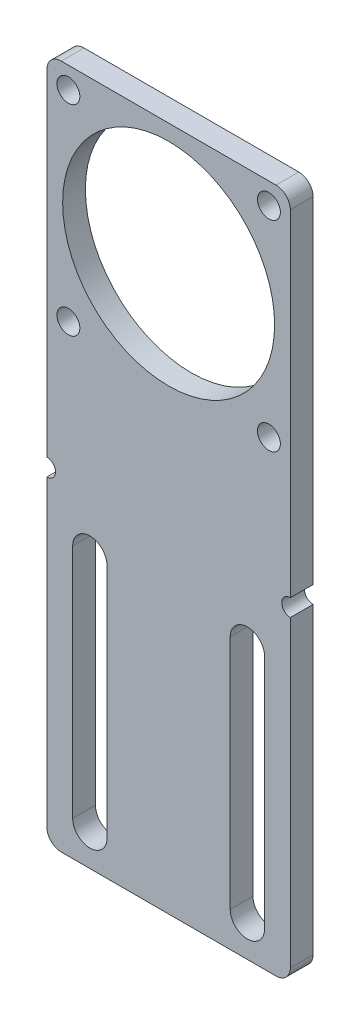
ISO-10303-21;
HEADER;
FILE_DESCRIPTION(('STEP AP214'),'2;1');
FILE_NAME('part.step','',(''),(''),'','','');
FILE_SCHEMA(('AUTOMOTIVE_DESIGN { 1 0 10303 214 1 1 1 1 }'));
ENDSEC;
DATA;
#1=APPLICATION_CONTEXT('core data for automotive mechanical design processes');
#2=APPLICATION_PROTOCOL_DEFINITION('international standard','automotive_design',2000,#1);
#3=PRODUCT_CONTEXT('',#1,'mechanical');
#4=PRODUCT('Part','Part','',(#3));
#5=PRODUCT_RELATED_PRODUCT_CATEGORY('part','',(#4));
#6=PRODUCT_DEFINITION_FORMATION('','',#4);
#7=PRODUCT_DEFINITION_CONTEXT('part definition',#1,'design');
#8=PRODUCT_DEFINITION('design','',#6,#7);
#9=PRODUCT_DEFINITION_SHAPE('','',#8);
#10=(LENGTH_UNIT() NAMED_UNIT(*) SI_UNIT(.MILLI.,.METRE.));
#11=(NAMED_UNIT(*) PLANE_ANGLE_UNIT() SI_UNIT($,.RADIAN.));
#12=(NAMED_UNIT(*) SI_UNIT($,.STERADIAN.) SOLID_ANGLE_UNIT());
#13=UNCERTAINTY_MEASURE_WITH_UNIT(LENGTH_MEASURE(1.E-05),#10,'distance_accuracy_value','');
#14=(GEOMETRIC_REPRESENTATION_CONTEXT(3) GLOBAL_UNCERTAINTY_ASSIGNED_CONTEXT((#13)) GLOBAL_UNIT_ASSIGNED_CONTEXT((#10,
#11,#12)) REPRESENTATION_CONTEXT('',''));
#15=CARTESIAN_POINT('',(0.,0.,0.));
#16=DIRECTION('',(0.,0.,1.));
#17=DIRECTION('',(1.,0.,0.));
#18=AXIS2_PLACEMENT_3D('',#15,#16,#17);
#19=CARTESIAN_POINT('',(42.5,-76.6338758827366,6.34999999999999));
#20=DIRECTION('',(-1.,0.,0.));
#21=DIRECTION('',(0.,1.,0.));
#22=AXIS2_PLACEMENT_3D('',#19,#20,#21);
#23=PLANE('',#22);
#24=DIRECTION('',(0.,0.,1.));
#25=VECTOR('',#24,1.);
#26=CARTESIAN_POINT('',(42.5,-85.7419379413683,-1.58750000000002));
#27=LINE('',#26,#25);
#28=CARTESIAN_POINT('',(42.5,-85.7419379413683,6.35));
#29=VERTEX_POINT('',#28);
#30=CARTESIAN_POINT('',(42.5,-85.7419379413683,-1.5875));
#31=VERTEX_POINT('',#30);
#32=EDGE_CURVE('E56',#29,#31,#27,.F.);
#33=ORIENTED_EDGE('',*,*,#32,.F.);
#34=DIRECTION('',(0.,1.,0.));
#35=VECTOR('',#34,1.);
#36=CARTESIAN_POINT('',(42.5,-76.6338758827366,6.34999999999999));
#37=LINE('',#36,#35);
#38=CARTESIAN_POINT('',(42.5,-191.633875882737,6.34999999999999));
#39=VERTEX_POINT('',#38);
#40=EDGE_CURVE('E301',#39,#29,#37,.T.);
#41=ORIENTED_EDGE('',*,*,#40,.F.);
#42=DIRECTION('',(0.,0.,1.));
#43=VECTOR('',#42,1.);
#44=CARTESIAN_POINT('',(42.5,-191.633875882737,6.34999999999999));
#45=LINE('',#44,#43);
#46=CARTESIAN_POINT('',(42.5,-191.633875882737,-1.58750000000001));
#47=VERTEX_POINT('',#46);
#48=EDGE_CURVE('E244',#47,#39,#45,.T.);
#49=ORIENTED_EDGE('',*,*,#48,.F.);
#50=DIRECTION('',(0.,1.,0.));
#51=VECTOR('',#50,1.);
#52=CARTESIAN_POINT('',(42.5,-191.633875882737,-1.58750000000001));
#53=LINE('',#52,#51);
#54=EDGE_CURVE('E199',#47,#31,#53,.T.);
#55=ORIENTED_EDGE('',*,*,#54,.T.);
#56=EDGE_LOOP('',(#33,#41,#49,#55));
#57=FACE_BOUND('',#56,.T.);
#58=ADVANCED_FACE('F41',(#57),#23,.F.);
#59=CARTESIAN_POINT('',(-42.5,-76.6338758827366,6.34999999999999));
#60=DIRECTION('',(1.,0.,0.));
#61=DIRECTION('',(0.,-1.,0.));
#62=AXIS2_PLACEMENT_3D('',#59,#60,#61);
#63=PLANE('',#62);
#64=DIRECTION('',(0.,0.,1.));
#65=VECTOR('',#64,1.);
#66=CARTESIAN_POINT('',(-42.5,-79.7419379413683,-1.58750000000002));
#67=LINE('',#66,#65);
#68=CARTESIAN_POINT('',(-42.5,-79.7419379413683,6.35));
#69=VERTEX_POINT('',#68);
#70=CARTESIAN_POINT('',(-42.5,-79.7419379413683,-1.5875));
#71=VERTEX_POINT('',#70);
#72=EDGE_CURVE('E63',#69,#71,#67,.F.);
#73=ORIENTED_EDGE('',*,*,#72,.F.);
#74=DIRECTION('',(0.,-1.,0.));
#75=VECTOR('',#74,1.);
#76=CARTESIAN_POINT('',(-42.5,-76.6338758827366,6.34999999999999));
#77=LINE('',#76,#75);
#78=CARTESIAN_POINT('',(-42.5,37.5,6.35));
#79=VERTEX_POINT('',#78);
#80=EDGE_CURVE('E297',#79,#69,#77,.T.);
#81=ORIENTED_EDGE('',*,*,#80,.F.);
#82=DIRECTION('',(0.,0.,1.));
#83=VECTOR('',#82,1.);
#84=CARTESIAN_POINT('',(-42.5,37.5,6.35));
#85=LINE('',#84,#83);
#86=CARTESIAN_POINT('',(-42.5,37.5,-1.5875));
#87=VERTEX_POINT('',#86);
#88=EDGE_CURVE('E318',#87,#79,#85,.T.);
#89=ORIENTED_EDGE('',*,*,#88,.F.);
#90=DIRECTION('',(0.,1.,0.));
#91=VECTOR('',#90,1.);
#92=CARTESIAN_POINT('',(-42.5,-191.633875882737,-1.58750000000001));
#93=LINE('',#92,#91);
#94=EDGE_CURVE('E220',#87,#71,#93,.F.);
#95=ORIENTED_EDGE('',*,*,#94,.T.);
#96=EDGE_LOOP('',(#73,#81,#89,#95));
#97=FACE_BOUND('',#96,.T.);
#98=ADVANCED_FACE('F401',(#97),#63,.F.);
#99=CARTESIAN_POINT('',(27.5,-102.073275951375,6.34999999999999));
#100=DIRECTION('',(0.,0.,1.));
#101=DIRECTION('',(0.,-1.,0.));
#102=AXIS2_PLACEMENT_3D('',#99,#100,#101);
#103=CYLINDRICAL_SURFACE('',#102,6.);
#104=DIRECTION('',(0.,0.,1.));
#105=VECTOR('',#104,1.);
#106=CARTESIAN_POINT('',(21.5,-102.073275951375,6.34999999999999));
#107=LINE('',#106,#105);
#108=CARTESIAN_POINT('',(21.5,-102.073275951375,-1.58750000000001));
#109=VERTEX_POINT('',#108);
#110=CARTESIAN_POINT('',(21.5,-102.073275951375,6.34999999999999));
#111=VERTEX_POINT('',#110);
#112=EDGE_CURVE('E49',#109,#111,#107,.T.);
#113=ORIENTED_EDGE('',*,*,#112,.F.);
#114=CARTESIAN_POINT('',(27.5,-102.073275951375,-1.58750000000001));
#115=DIRECTION('',(0.,0.,1.));
#116=DIRECTION('',(0.,-1.,0.));
#117=AXIS2_PLACEMENT_3D('',#114,#115,#116);
#118=CIRCLE('',#117,6.);
#119=CARTESIAN_POINT('',(33.5,-102.073275951375,-1.58750000000001));
#120=VERTEX_POINT('',#119);
#121=EDGE_CURVE('E239',#120,#109,#118,.T.);
#122=ORIENTED_EDGE('',*,*,#121,.F.);
#123=DIRECTION('',(0.,0.,1.));
#124=VECTOR('',#123,1.);
#125=CARTESIAN_POINT('',(33.5,-102.073275951375,6.34999999999999));
#126=LINE('',#125,#124);
#127=CARTESIAN_POINT('',(33.5,-102.073275951375,6.34999999999999));
#128=VERTEX_POINT('',#127);
#129=EDGE_CURVE('E264',#120,#128,#126,.T.);
#130=ORIENTED_EDGE('',*,*,#129,.T.);
#131=CARTESIAN_POINT('',(27.5,-102.073275951375,6.34999999999999));
#132=DIRECTION('',(0.,0.,1.));
#133=DIRECTION('',(0.,-1.,0.));
#134=AXIS2_PLACEMENT_3D('',#131,#132,#133);
#135=CIRCLE('',#134,6.);
#136=EDGE_CURVE('E286',#128,#111,#135,.T.);
#137=ORIENTED_EDGE('',*,*,#136,.T.);
#138=EDGE_LOOP('',(#113,#122,#130,#137));
#139=FACE_BOUND('',#138,.T.);
#140=ADVANCED_FACE('F427',(#139),#103,.F.);
#141=CARTESIAN_POINT('',(33.5,-184.435835629482,6.34999999999999));
#142=DIRECTION('',(-1.,0.,0.));
#143=DIRECTION('',(0.,1.,0.));
#144=AXIS2_PLACEMENT_3D('',#141,#142,#143);
#145=PLANE('',#144);
#146=ORIENTED_EDGE('',*,*,#129,.F.);
#147=DIRECTION('',(0.,1.,0.));
#148=VECTOR('',#147,1.);
#149=CARTESIAN_POINT('',(33.5,-191.633875882737,-1.58750000000001));
#150=LINE('',#149,#148);
#151=CARTESIAN_POINT('',(33.5,-184.435835629482,-1.58750000000001));
#152=VERTEX_POINT('',#151);
#153=EDGE_CURVE('E235',#152,#120,#150,.T.);
#154=ORIENTED_EDGE('',*,*,#153,.F.);
#155=DIRECTION('',(0.,0.,1.));
#156=VECTOR('',#155,1.);
#157=CARTESIAN_POINT('',(33.5,-184.435835629482,6.34999999999999));
#158=LINE('',#157,#156);
#159=CARTESIAN_POINT('',(33.5,-184.435835629482,6.34999999999999));
#160=VERTEX_POINT('',#159);
#161=EDGE_CURVE('E262',#152,#160,#158,.T.);
#162=ORIENTED_EDGE('',*,*,#161,.T.);
#163=DIRECTION('',(0.,1.,0.));
#164=VECTOR('',#163,1.);
#165=CARTESIAN_POINT('',(33.5,-184.435835629482,6.34999999999999));
#166=LINE('',#165,#164);
#167=EDGE_CURVE('E208',#160,#128,#166,.T.);
#168=ORIENTED_EDGE('',*,*,#167,.T.);
#169=EDGE_LOOP('',(#146,#154,#162,#168));
#170=FACE_BOUND('',#169,.T.);
#171=ADVANCED_FACE('F461',(#170),#145,.T.);
#172=CARTESIAN_POINT('',(27.5,-184.435835629482,6.34999999999999));
#173=DIRECTION('',(0.,0.,1.));
#174=DIRECTION('',(0.,-1.,0.));
#175=AXIS2_PLACEMENT_3D('',#172,#173,#174);
#176=CYLINDRICAL_SURFACE('',#175,6.);
#177=ORIENTED_EDGE('',*,*,#161,.F.);
#178=CARTESIAN_POINT('',(27.5,-184.435835629482,-1.58750000000001));
#179=DIRECTION('',(0.,0.,1.));
#180=DIRECTION('',(0.,-1.,0.));
#181=AXIS2_PLACEMENT_3D('',#178,#179,#180);
#182=CIRCLE('',#181,6.);
#183=CARTESIAN_POINT('',(21.5,-184.435835629482,-1.58750000000001));
#184=VERTEX_POINT('',#183);
#185=EDGE_CURVE('E213',#184,#152,#182,.T.);
#186=ORIENTED_EDGE('',*,*,#185,.F.);
#187=DIRECTION('',(0.,0.,1.));
#188=VECTOR('',#187,1.);
#189=CARTESIAN_POINT('',(21.5,-184.435835629482,6.34999999999999));
#190=LINE('',#189,#188);
#191=CARTESIAN_POINT('',(21.5,-184.435835629482,6.34999999999999));
#192=VERTEX_POINT('',#191);
#193=EDGE_CURVE('E260',#184,#192,#190,.T.);
#194=ORIENTED_EDGE('',*,*,#193,.T.);
#195=CARTESIAN_POINT('',(27.5,-184.435835629482,6.34999999999999));
#196=DIRECTION('',(0.,0.,1.));
#197=DIRECTION('',(0.,-1.,0.));
#198=AXIS2_PLACEMENT_3D('',#195,#196,#197);
#199=CIRCLE('',#198,6.);
#200=EDGE_CURVE('E271',#192,#160,#199,.T.);
#201=ORIENTED_EDGE('',*,*,#200,.T.);
#202=EDGE_LOOP('',(#177,#186,#194,#201));
#203=FACE_BOUND('',#202,.T.);
#204=ADVANCED_FACE('F270',(#203),#176,.F.);
#205=CARTESIAN_POINT('',(-27.5,-102.073275951375,6.34999999999999));
#206=DIRECTION('',(0.,0.,1.));
#207=DIRECTION('',(0.,-1.,0.));
#208=AXIS2_PLACEMENT_3D('',#205,#206,#207);
#209=CYLINDRICAL_SURFACE('',#208,6.);
#210=DIRECTION('',(0.,0.,1.));
#211=VECTOR('',#210,1.);
#212=CARTESIAN_POINT('',(-33.5,-102.073275951375,6.34999999999999));
#213=LINE('',#212,#211);
#214=CARTESIAN_POINT('',(-33.5,-102.073275951375,-1.58750000000001));
#215=VERTEX_POINT('',#214);
#216=CARTESIAN_POINT('',(-33.5,-102.073275951375,6.34999999999999));
#217=VERTEX_POINT('',#216);
#218=EDGE_CURVE('E258',#215,#217,#213,.T.);
#219=ORIENTED_EDGE('',*,*,#218,.F.);
#220=CARTESIAN_POINT('',(-27.5,-102.073275951375,-1.58750000000001));
#221=DIRECTION('',(0.,0.,1.));
#222=DIRECTION('',(0.,-1.,0.));
#223=AXIS2_PLACEMENT_3D('',#220,#221,#222);
#224=CIRCLE('',#223,6.);
#225=CARTESIAN_POINT('',(-21.5,-102.073275951375,-1.58750000000001));
#226=VERTEX_POINT('',#225);
#227=EDGE_CURVE('E204',#226,#215,#224,.T.);
#228=ORIENTED_EDGE('',*,*,#227,.F.);
#229=DIRECTION('',(0.,0.,1.));
#230=VECTOR('',#229,1.);
#231=CARTESIAN_POINT('',(-21.5,-102.073275951375,6.34999999999999));
#232=LINE('',#231,#230);
#233=CARTESIAN_POINT('',(-21.5,-102.073275951375,6.34999999999999));
#234=VERTEX_POINT('',#233);
#235=EDGE_CURVE('E256',#226,#234,#232,.T.);
#236=ORIENTED_EDGE('',*,*,#235,.T.);
#237=CARTESIAN_POINT('',(-27.5,-102.073275951375,6.34999999999999));
#238=DIRECTION('',(0.,0.,1.));
#239=DIRECTION('',(0.,-1.,0.));
#240=AXIS2_PLACEMENT_3D('',#237,#238,#239);
#241=CIRCLE('',#240,6.);
#242=EDGE_CURVE('E307',#234,#217,#241,.T.);
#243=ORIENTED_EDGE('',*,*,#242,.T.);
#244=EDGE_LOOP('',(#219,#228,#236,#243));
#245=FACE_BOUND('',#244,.T.);
#246=ADVANCED_FACE('F454',(#245),#209,.F.);
#247=CARTESIAN_POINT('',(-21.5,-184.435835629482,6.34999999999999));
#248=DIRECTION('',(-1.,0.,0.));
#249=DIRECTION('',(0.,1.,0.));
#250=AXIS2_PLACEMENT_3D('',#247,#248,#249);
#251=PLANE('',#250);
#252=ORIENTED_EDGE('',*,*,#235,.F.);
#253=DIRECTION('',(0.,1.,0.));
#254=VECTOR('',#253,1.);
#255=CARTESIAN_POINT('',(-21.5,-191.633875882737,-1.58750000000001));
#256=LINE('',#255,#254);
#257=CARTESIAN_POINT('',(-21.5,-184.435835629482,-1.58750000000001));
#258=VERTEX_POINT('',#257);
#259=EDGE_CURVE('E200',#258,#226,#256,.T.);
#260=ORIENTED_EDGE('',*,*,#259,.F.);
#261=DIRECTION('',(0.,0.,1.));
#262=VECTOR('',#261,1.);
#263=CARTESIAN_POINT('',(-21.5,-184.435835629482,6.34999999999999));
#264=LINE('',#263,#262);
#265=CARTESIAN_POINT('',(-21.5,-184.435835629482,6.34999999999999));
#266=VERTEX_POINT('',#265);
#267=EDGE_CURVE('E254',#258,#266,#264,.T.);
#268=ORIENTED_EDGE('',*,*,#267,.T.);
#269=DIRECTION('',(0.,1.,0.));
#270=VECTOR('',#269,1.);
#271=CARTESIAN_POINT('',(-21.5,-184.435835629482,6.34999999999999));
#272=LINE('',#271,#270);
#273=EDGE_CURVE('E304',#266,#234,#272,.T.);
#274=ORIENTED_EDGE('',*,*,#273,.T.);
#275=EDGE_LOOP('',(#252,#260,#268,#274));
#276=FACE_BOUND('',#275,.T.);
#277=ADVANCED_FACE('F450',(#276),#251,.T.);
#278=CARTESIAN_POINT('',(-27.5,-184.435835629482,6.34999999999999));
#279=DIRECTION('',(0.,0.,1.));
#280=DIRECTION('',(0.,-1.,0.));
#281=AXIS2_PLACEMENT_3D('',#278,#279,#280);
#282=CYLINDRICAL_SURFACE('',#281,6.);
#283=ORIENTED_EDGE('',*,*,#267,.F.);
#284=CARTESIAN_POINT('',(-27.5,-184.435835629482,-1.58750000000001));
#285=DIRECTION('',(0.,0.,1.));
#286=DIRECTION('',(0.,-1.,0.));
#287=AXIS2_PLACEMENT_3D('',#284,#285,#286);
#288=CIRCLE('',#287,6.);
#289=CARTESIAN_POINT('',(-33.5,-184.435835629482,-1.58750000000001));
#290=VERTEX_POINT('',#289);
#291=EDGE_CURVE('E223',#290,#258,#288,.T.);
#292=ORIENTED_EDGE('',*,*,#291,.F.);
#293=DIRECTION('',(0.,0.,1.));
#294=VECTOR('',#293,1.);
#295=CARTESIAN_POINT('',(-33.5,-184.435835629482,6.34999999999999));
#296=LINE('',#295,#294);
#297=CARTESIAN_POINT('',(-33.5,-184.435835629482,6.34999999999999));
#298=VERTEX_POINT('',#297);
#299=EDGE_CURVE('E253',#290,#298,#296,.T.);
#300=ORIENTED_EDGE('',*,*,#299,.T.);
#301=CARTESIAN_POINT('',(-27.5,-184.435835629482,6.34999999999999));
#302=DIRECTION('',(0.,0.,1.));
#303=DIRECTION('',(0.,-1.,0.));
#304=AXIS2_PLACEMENT_3D('',#301,#302,#303);
#305=CIRCLE('',#304,6.);
#306=EDGE_CURVE('E238',#298,#266,#305,.T.);
#307=ORIENTED_EDGE('',*,*,#306,.T.);
#308=EDGE_LOOP('',(#283,#292,#300,#307));
#309=FACE_BOUND('',#308,.T.);
#310=ADVANCED_FACE('F447',(#309),#282,.F.);
#311=DIRECTION('',(0.,0.,1.));
#312=VECTOR('',#311,1.);
#313=CARTESIAN_POINT('',(-42.5,-85.7419379413683,-1.58750000000002));
#314=LINE('',#313,#312);
#315=CARTESIAN_POINT('',(-42.5,-85.7419379413683,-1.58750000000002));
#316=VERTEX_POINT('',#315);
#317=CARTESIAN_POINT('',(-42.5,-85.7419379413683,6.35));
#318=VERTEX_POINT('',#317);
#319=EDGE_CURVE('E370',#316,#318,#314,.T.);
#320=ORIENTED_EDGE('',*,*,#319,.F.);
#321=CARTESIAN_POINT('',(-42.5,-191.633875882737,-1.58750000000001));
#322=VERTEX_POINT('',#321);
#323=EDGE_CURVE('E202',#316,#322,#93,.F.);
#324=ORIENTED_EDGE('',*,*,#323,.T.);
#325=DIRECTION('',(0.,0.,1.));
#326=VECTOR('',#325,1.);
#327=CARTESIAN_POINT('',(-42.5,-191.633875882737,6.34999999999999));
#328=LINE('',#327,#326);
#329=CARTESIAN_POINT('',(-42.5,-191.633875882737,6.34999999999999));
#330=VERTEX_POINT('',#329);
#331=EDGE_CURVE('E250',#322,#330,#328,.T.);
#332=ORIENTED_EDGE('',*,*,#331,.T.);
#333=EDGE_CURVE('E300',#318,#330,#77,.T.);
#334=ORIENTED_EDGE('',*,*,#333,.F.);
#335=EDGE_LOOP('',(#320,#324,#332,#334));
#336=FACE_BOUND('',#335,.T.);
#337=ADVANCED_FACE('F396',(#336),#63,.F.);
#338=CARTESIAN_POINT('',(-37.5,-191.633875882737,6.34999999999999));
#339=DIRECTION('',(0.,0.,1.));
#340=DIRECTION('',(0.,-1.,0.));
#341=AXIS2_PLACEMENT_3D('',#338,#339,#340);
#342=CYLINDRICAL_SURFACE('',#341,5.00000000000001);
#343=ORIENTED_EDGE('',*,*,#331,.F.);
#344=CARTESIAN_POINT('',(-37.5,-191.633875882737,-1.58750000000001));
#345=DIRECTION('',(0.,0.,1.));
#346=DIRECTION('',(0.,-1.,0.));
#347=AXIS2_PLACEMENT_3D('',#344,#345,#346);
#348=CIRCLE('',#347,5.00000000000001);
#349=CARTESIAN_POINT('',(-37.5,-196.633875882737,-1.58750000000002));
#350=VERTEX_POINT('',#349);
#351=EDGE_CURVE('E217',#322,#350,#348,.T.);
#352=ORIENTED_EDGE('',*,*,#351,.T.);
#353=DIRECTION('',(0.,0.,1.));
#354=VECTOR('',#353,1.);
#355=CARTESIAN_POINT('',(-37.5,-196.633875882737,6.34999999999998));
#356=LINE('',#355,#354);
#357=CARTESIAN_POINT('',(-37.5,-196.633875882737,6.34999999999998));
#358=VERTEX_POINT('',#357);
#359=EDGE_CURVE('E248',#350,#358,#356,.T.);
#360=ORIENTED_EDGE('',*,*,#359,.T.);
#361=CARTESIAN_POINT('',(-37.5,-191.633875882737,6.34999999999999));
#362=DIRECTION('',(0.,0.,1.));
#363=DIRECTION('',(0.,1.,0.));
#364=AXIS2_PLACEMENT_3D('',#361,#362,#363);
#365=CIRCLE('',#364,5.00000000000001);
#366=EDGE_CURVE('E294',#330,#358,#365,.T.);
#367=ORIENTED_EDGE('',*,*,#366,.F.);
#368=EDGE_LOOP('',(#343,#352,#360,#367));
#369=FACE_BOUND('',#368,.T.);
#370=ADVANCED_FACE('F391',(#369),#342,.T.);
#371=CARTESIAN_POINT('',(37.5,-196.633875882737,6.34999999999998));
#372=DIRECTION('',(0.,1.,0.));
#373=DIRECTION('',(1.,0.,0.));
#374=AXIS2_PLACEMENT_3D('',#371,#372,#373);
#375=PLANE('',#374);
#376=ORIENTED_EDGE('',*,*,#359,.F.);
#377=DIRECTION('',(1.,0.,0.));
#378=VECTOR('',#377,1.);
#379=CARTESIAN_POINT('',(37.5,-196.633875882737,-1.58750000000002));
#380=LINE('',#379,#378);
#381=CARTESIAN_POINT('',(37.5,-196.633875882737,-1.58750000000002));
#382=VERTEX_POINT('',#381);
#383=EDGE_CURVE('E214',#350,#382,#380,.T.);
#384=ORIENTED_EDGE('',*,*,#383,.T.);
#385=DIRECTION('',(0.,0.,1.));
#386=VECTOR('',#385,1.);
#387=CARTESIAN_POINT('',(37.5,-196.633875882737,6.34999999999998));
#388=LINE('',#387,#386);
#389=CARTESIAN_POINT('',(37.5,-196.633875882737,6.34999999999998));
#390=VERTEX_POINT('',#389);
#391=EDGE_CURVE('E246',#382,#390,#388,.T.);
#392=ORIENTED_EDGE('',*,*,#391,.T.);
#393=DIRECTION('',(1.,0.,0.));
#394=VECTOR('',#393,1.);
#395=CARTESIAN_POINT('',(37.5,-196.633875882737,6.34999999999998));
#396=LINE('',#395,#394);
#397=EDGE_CURVE('E291',#358,#390,#396,.T.);
#398=ORIENTED_EDGE('',*,*,#397,.F.);
#399=EDGE_LOOP('',(#376,#384,#392,#398));
#400=FACE_BOUND('',#399,.T.);
#401=ADVANCED_FACE('F387',(#400),#375,.F.);
#402=CARTESIAN_POINT('',(37.5,-191.633875882737,6.34999999999999));
#403=DIRECTION('',(0.,0.,1.));
#404=DIRECTION('',(0.,-1.,0.));
#405=AXIS2_PLACEMENT_3D('',#402,#403,#404);
#406=CYLINDRICAL_SURFACE('',#405,5.);
#407=ORIENTED_EDGE('',*,*,#391,.F.);
#408=CARTESIAN_POINT('',(37.5,-191.633875882737,-1.58750000000001));
#409=DIRECTION('',(0.,0.,1.));
#410=DIRECTION('',(0.,-1.,0.));
#411=AXIS2_PLACEMENT_3D('',#408,#409,#410);
#412=CIRCLE('',#411,5.);
#413=EDGE_CURVE('E210',#382,#47,#412,.T.);
#414=ORIENTED_EDGE('',*,*,#413,.T.);
#415=ORIENTED_EDGE('',*,*,#48,.T.);
#416=CARTESIAN_POINT('',(37.5,-191.633875882737,6.34999999999999));
#417=DIRECTION('',(0.,0.,1.));
#418=DIRECTION('',(0.,1.,0.));
#419=AXIS2_PLACEMENT_3D('',#416,#417,#418);
#420=CIRCLE('',#419,5.);
#421=EDGE_CURVE('E283',#390,#39,#420,.T.);
#422=ORIENTED_EDGE('',*,*,#421,.F.);
#423=EDGE_LOOP('',(#407,#414,#415,#422));
#424=FACE_BOUND('',#423,.T.);
#425=ADVANCED_FACE('F382',(#424),#406,.T.);
#426=DIRECTION('',(0.,0.,1.));
#427=VECTOR('',#426,1.);
#428=CARTESIAN_POINT('',(42.5,-79.7419379413683,-1.58750000000002));
#429=LINE('',#428,#427);
#430=CARTESIAN_POINT('',(42.5,-79.7419379413683,-1.58750000000002));
#431=VERTEX_POINT('',#430);
#432=CARTESIAN_POINT('',(42.5,-79.7419379413683,6.35));
#433=VERTEX_POINT('',#432);
#434=EDGE_CURVE('E177',#431,#433,#429,.T.);
#435=ORIENTED_EDGE('',*,*,#434,.F.);
#436=CARTESIAN_POINT('',(42.5,37.5,-1.5875));
#437=VERTEX_POINT('',#436);
#438=EDGE_CURVE('E189',#431,#437,#53,.T.);
#439=ORIENTED_EDGE('',*,*,#438,.T.);
#440=DIRECTION('',(0.,0.,1.));
#441=VECTOR('',#440,1.);
#442=CARTESIAN_POINT('',(42.5,37.5,6.35));
#443=LINE('',#442,#441);
#444=CARTESIAN_POINT('',(42.5,37.5,6.35));
#445=VERTEX_POINT('',#444);
#446=EDGE_CURVE('E353',#437,#445,#443,.T.);
#447=ORIENTED_EDGE('',*,*,#446,.T.);
#448=EDGE_CURVE('E191',#433,#445,#37,.T.);
#449=ORIENTED_EDGE('',*,*,#448,.F.);
#450=EDGE_LOOP('',(#435,#439,#447,#449));
#451=FACE_BOUND('',#450,.T.);
#452=ADVANCED_FACE('F187',(#451),#23,.F.);
#453=CARTESIAN_POINT('',(-33.5,-184.435835629482,6.34999999999999));
#454=DIRECTION('',(1.,0.,0.));
#455=DIRECTION('',(0.,-1.,0.));
#456=AXIS2_PLACEMENT_3D('',#453,#454,#455);
#457=PLANE('',#456);
#458=DIRECTION('',(0.,1.,0.));
#459=VECTOR('',#458,1.);
#460=CARTESIAN_POINT('',(-33.5,-191.633875882737,-1.58750000000001));
#461=LINE('',#460,#459);
#462=EDGE_CURVE('E225',#215,#290,#461,.F.);
#463=ORIENTED_EDGE('',*,*,#462,.F.);
#464=ORIENTED_EDGE('',*,*,#218,.T.);
#465=DIRECTION('',(0.,-1.,0.));
#466=VECTOR('',#465,1.);
#467=CARTESIAN_POINT('',(-33.5,-184.435835629482,6.34999999999999));
#468=LINE('',#467,#466);
#469=EDGE_CURVE('E310',#217,#298,#468,.T.);
#470=ORIENTED_EDGE('',*,*,#469,.T.);
#471=ORIENTED_EDGE('',*,*,#299,.F.);
#472=EDGE_LOOP('',(#463,#464,#470,#471));
#473=FACE_BOUND('',#472,.T.);
#474=ADVANCED_FACE('F432',(#473),#457,.T.);
#475=CARTESIAN_POINT('',(21.5,-184.435835629482,6.34999999999999));
#476=DIRECTION('',(1.,0.,0.));
#477=DIRECTION('',(0.,-1.,0.));
#478=AXIS2_PLACEMENT_3D('',#475,#476,#477);
#479=PLANE('',#478);
#480=DIRECTION('',(0.,1.,0.));
#481=VECTOR('',#480,1.);
#482=CARTESIAN_POINT('',(21.5,-191.633875882737,-1.58750000000001));
#483=LINE('',#482,#481);
#484=EDGE_CURVE('E234',#109,#184,#483,.F.);
#485=ORIENTED_EDGE('',*,*,#484,.F.);
#486=ORIENTED_EDGE('',*,*,#112,.T.);
#487=DIRECTION('',(0.,-1.,0.));
#488=VECTOR('',#487,1.);
#489=CARTESIAN_POINT('',(21.5,-184.435835629482,6.34999999999999));
#490=LINE('',#489,#488);
#491=EDGE_CURVE('E280',#111,#192,#490,.T.);
#492=ORIENTED_EDGE('',*,*,#491,.T.);
#493=ORIENTED_EDGE('',*,*,#193,.F.);
#494=EDGE_LOOP('',(#485,#486,#492,#493));
#495=FACE_BOUND('',#494,.T.);
#496=ADVANCED_FACE('F285',(#495),#479,.T.);
#497=CARTESIAN_POINT('',(0.,0.,6.35));
#498=DIRECTION('',(0.,0.,1.));
#499=DIRECTION('',(1.,0.,0.));
#500=AXIS2_PLACEMENT_3D('',#497,#498,#499);
#501=PLANE('',#500);
#502=CARTESIAN_POINT('',(42.5,-82.7419379413683,6.35));
#503=DIRECTION('',(0.,0.,1.));
#504=DIRECTION('',(1.,0.,0.));
#505=AXIS2_PLACEMENT_3D('',#502,#503,#504);
#506=CIRCLE('',#505,3.);
#507=EDGE_CURVE('E183',#433,#29,#506,.T.);
#508=ORIENTED_EDGE('',*,*,#507,.F.);
#509=ORIENTED_EDGE('',*,*,#448,.T.);
#510=CARTESIAN_POINT('',(37.5,37.5,6.35));
#511=DIRECTION('',(0.,0.,1.));
#512=DIRECTION('',(1.,0.,0.));
#513=AXIS2_PLACEMENT_3D('',#510,#511,#512);
#514=CIRCLE('',#513,5.);
#515=CARTESIAN_POINT('',(37.5,42.5,6.35));
#516=VERTEX_POINT('',#515);
#517=EDGE_CURVE('E344',#445,#516,#514,.T.);
#518=ORIENTED_EDGE('',*,*,#517,.T.);
#519=DIRECTION('',(-1.,0.,0.));
#520=VECTOR('',#519,1.);
#521=CARTESIAN_POINT('',(0.,42.5,6.35));
#522=LINE('',#521,#520);
#523=CARTESIAN_POINT('',(-37.5,42.5,6.35));
#524=VERTEX_POINT('',#523);
#525=EDGE_CURVE('E347',#516,#524,#522,.T.);
#526=ORIENTED_EDGE('',*,*,#525,.T.);
#527=CARTESIAN_POINT('',(-37.5,37.5,6.35));
#528=DIRECTION('',(0.,0.,1.));
#529=DIRECTION('',(1.,0.,0.));
#530=AXIS2_PLACEMENT_3D('',#527,#528,#529);
#531=CIRCLE('',#530,5.);
#532=EDGE_CURVE('E350',#524,#79,#531,.T.);
#533=ORIENTED_EDGE('',*,*,#532,.T.);
#534=ORIENTED_EDGE('',*,*,#80,.T.);
#535=CARTESIAN_POINT('',(-42.5,-82.7419379413683,6.35));
#536=DIRECTION('',(0.,0.,1.));
#537=DIRECTION('',(1.,0.,0.));
#538=AXIS2_PLACEMENT_3D('',#535,#536,#537);
#539=CIRCLE('',#538,3.);
#540=EDGE_CURVE('E372',#318,#69,#539,.T.);
#541=ORIENTED_EDGE('',*,*,#540,.F.);
#542=ORIENTED_EDGE('',*,*,#333,.T.);
#543=ORIENTED_EDGE('',*,*,#366,.T.);
#544=ORIENTED_EDGE('',*,*,#397,.T.);
#545=ORIENTED_EDGE('',*,*,#421,.T.);
#546=ORIENTED_EDGE('',*,*,#40,.T.);
#547=EDGE_LOOP('',(#508,#509,#518,#526,#533,#534,#541,#542,#543,#544,#545,#546));
#548=FACE_BOUND('',#547,.T.);
#549=ORIENTED_EDGE('',*,*,#306,.F.);
#550=ORIENTED_EDGE('',*,*,#469,.F.);
#551=ORIENTED_EDGE('',*,*,#242,.F.);
#552=ORIENTED_EDGE('',*,*,#273,.F.);
#553=EDGE_LOOP('',(#549,#550,#551,#552));
#554=FACE_BOUND('',#553,.T.);
#555=ORIENTED_EDGE('',*,*,#200,.F.);
#556=ORIENTED_EDGE('',*,*,#491,.F.);
#557=ORIENTED_EDGE('',*,*,#136,.F.);
#558=ORIENTED_EDGE('',*,*,#167,.F.);
#559=EDGE_LOOP('',(#555,#556,#557,#558));
#560=FACE_BOUND('',#559,.T.);
#561=CARTESIAN_POINT('',(0.,0.,6.35));
#562=DIRECTION('',(0.,0.,1.));
#563=DIRECTION('',(1.,0.,0.));
#564=AXIS2_PLACEMENT_3D('',#561,#562,#563);
#565=CIRCLE('',#564,37.);
#566=CARTESIAN_POINT('',(37.,0.,6.35));
#567=VERTEX_POINT('',#566);
#568=EDGE_CURVE('E341',#567,#567,#565,.T.);
#569=ORIENTED_EDGE('',*,*,#568,.F.);
#570=EDGE_LOOP('',(#569));
#571=FACE_BOUND('',#570,.T.);
#572=CARTESIAN_POINT('',(-35.,-35.,6.35));
#573=DIRECTION('',(0.,0.,1.));
#574=DIRECTION('',(1.,0.,0.));
#575=AXIS2_PLACEMENT_3D('',#572,#573,#574);
#576=CIRCLE('',#575,4.);
#577=CARTESIAN_POINT('',(-31.,-35.,6.35));
#578=VERTEX_POINT('',#577);
#579=EDGE_CURVE('E338',#578,#578,#576,.T.);
#580=ORIENTED_EDGE('',*,*,#579,.F.);
#581=EDGE_LOOP('',(#580));
#582=FACE_BOUND('',#581,.T.);
#583=CARTESIAN_POINT('',(35.,-35.,6.35));
#584=DIRECTION('',(0.,0.,1.));
#585=DIRECTION('',(1.,0.,0.));
#586=AXIS2_PLACEMENT_3D('',#583,#584,#585);
#587=CIRCLE('',#586,4.);
#588=CARTESIAN_POINT('',(39.,-35.,6.35));
#589=VERTEX_POINT('',#588);
#590=EDGE_CURVE('E335',#589,#589,#587,.T.);
#591=ORIENTED_EDGE('',*,*,#590,.F.);
#592=EDGE_LOOP('',(#591));
#593=FACE_BOUND('',#592,.T.);
#594=CARTESIAN_POINT('',(34.9999999999998,35.,6.35));
#595=DIRECTION('',(0.,0.,1.));
#596=DIRECTION('',(1.,0.,0.));
#597=AXIS2_PLACEMENT_3D('',#594,#595,#596);
#598=CIRCLE('',#597,4.);
#599=CARTESIAN_POINT('',(38.9999999999998,35.,6.35));
#600=VERTEX_POINT('',#599);
#601=EDGE_CURVE('E332',#600,#600,#598,.T.);
#602=ORIENTED_EDGE('',*,*,#601,.F.);
#603=EDGE_LOOP('',(#602));
#604=FACE_BOUND('',#603,.T.);
#605=CARTESIAN_POINT('',(-35.0000000000002,35.,6.35));
#606=DIRECTION('',(0.,0.,1.));
#607=DIRECTION('',(1.,0.,0.));
#608=AXIS2_PLACEMENT_3D('',#605,#606,#607);
#609=CIRCLE('',#608,4.);
#610=CARTESIAN_POINT('',(-31.0000000000002,35.,6.35));
#611=VERTEX_POINT('',#610);
#612=EDGE_CURVE('E329',#611,#611,#609,.T.);
#613=ORIENTED_EDGE('',*,*,#612,.F.);
#614=EDGE_LOOP('',(#613));
#615=FACE_BOUND('',#614,.T.);
#616=ADVANCED_FACE('F43',(#548,#554,#560,#571,#582,#593,#604,#615),#501,.T.);
#617=CARTESIAN_POINT('',(37.5,-191.633875882737,-1.58750000000001));
#618=DIRECTION('',(0.,0.,-1.));
#619=DIRECTION('',(0.,1.,0.));
#620=AXIS2_PLACEMENT_3D('',#617,#618,#619);
#621=PLANE('',#620);
#622=CARTESIAN_POINT('',(42.5,-82.7419379413683,-1.58750000000002));
#623=DIRECTION('',(0.,0.,1.));
#624=DIRECTION('',(1.,0.,0.));
#625=AXIS2_PLACEMENT_3D('',#622,#623,#624);
#626=CIRCLE('',#625,3.);
#627=EDGE_CURVE('E174',#431,#31,#626,.T.);
#628=ORIENTED_EDGE('',*,*,#627,.T.);
#629=ORIENTED_EDGE('',*,*,#54,.F.);
#630=ORIENTED_EDGE('',*,*,#413,.F.);
#631=ORIENTED_EDGE('',*,*,#383,.F.);
#632=ORIENTED_EDGE('',*,*,#351,.F.);
#633=ORIENTED_EDGE('',*,*,#323,.F.);
#634=CARTESIAN_POINT('',(-42.5,-82.7419379413683,-1.5875));
#635=DIRECTION('',(0.,0.,-1.));
#636=DIRECTION('',(0.,1.,0.));
#637=AXIS2_PLACEMENT_3D('',#634,#635,#636);
#638=CIRCLE('',#637,3.);
#639=EDGE_CURVE('E12',#71,#316,#638,.T.);
#640=ORIENTED_EDGE('',*,*,#639,.F.);
#641=ORIENTED_EDGE('',*,*,#94,.F.);
#642=CARTESIAN_POINT('',(-37.5,37.5,-1.5875));
#643=DIRECTION('',(0.,0.,1.));
#644=DIRECTION('',(1.,0.,0.));
#645=AXIS2_PLACEMENT_3D('',#642,#643,#644);
#646=CIRCLE('',#645,5.);
#647=CARTESIAN_POINT('',(-37.5,42.5,-1.5875));
#648=VERTEX_POINT('',#647);
#649=EDGE_CURVE('E315',#648,#87,#646,.T.);
#650=ORIENTED_EDGE('',*,*,#649,.F.);
#651=DIRECTION('',(1.,0.,0.));
#652=VECTOR('',#651,1.);
#653=CARTESIAN_POINT('',(0.,42.5,-1.5875));
#654=LINE('',#653,#652);
#655=CARTESIAN_POINT('',(37.5,42.5,-1.5875));
#656=VERTEX_POINT('',#655);
#657=EDGE_CURVE('E321',#656,#648,#654,.F.);
#658=ORIENTED_EDGE('',*,*,#657,.F.);
#659=CARTESIAN_POINT('',(37.5,37.5,-1.5875));
#660=DIRECTION('',(0.,0.,1.));
#661=DIRECTION('',(1.,0.,0.));
#662=AXIS2_PLACEMENT_3D('',#659,#660,#661);
#663=CIRCLE('',#662,5.);
#664=EDGE_CURVE('E198',#437,#656,#663,.T.);
#665=ORIENTED_EDGE('',*,*,#664,.F.);
#666=ORIENTED_EDGE('',*,*,#438,.F.);
#667=EDGE_LOOP('',(#628,#629,#630,#631,#632,#633,#640,#641,#650,#658,#665,#666));
#668=FACE_BOUND('',#667,.T.);
#669=ORIENTED_EDGE('',*,*,#291,.T.);
#670=ORIENTED_EDGE('',*,*,#259,.T.);
#671=ORIENTED_EDGE('',*,*,#227,.T.);
#672=ORIENTED_EDGE('',*,*,#462,.T.);
#673=EDGE_LOOP('',(#669,#670,#671,#672));
#674=FACE_BOUND('',#673,.T.);
#675=ORIENTED_EDGE('',*,*,#185,.T.);
#676=ORIENTED_EDGE('',*,*,#153,.T.);
#677=ORIENTED_EDGE('',*,*,#121,.T.);
#678=ORIENTED_EDGE('',*,*,#484,.T.);
#679=EDGE_LOOP('',(#675,#676,#677,#678));
#680=FACE_BOUND('',#679,.T.);
#681=CARTESIAN_POINT('',(0.,0.,-1.5875));
#682=DIRECTION('',(0.,0.,1.));
#683=DIRECTION('',(1.,0.,0.));
#684=AXIS2_PLACEMENT_3D('',#681,#682,#683);
#685=CIRCLE('',#684,37.);
#686=CARTESIAN_POINT('',(37.,0.,-1.5875));
#687=VERTEX_POINT('',#686);
#688=EDGE_CURVE('E355',#687,#687,#685,.T.);
#689=ORIENTED_EDGE('',*,*,#688,.T.);
#690=EDGE_LOOP('',(#689));
#691=FACE_BOUND('',#690,.T.);
#692=CARTESIAN_POINT('',(-35.,-35.,-1.5875));
#693=DIRECTION('',(0.,0.,1.));
#694=DIRECTION('',(1.,0.,0.));
#695=AXIS2_PLACEMENT_3D('',#692,#693,#694);
#696=CIRCLE('',#695,4.);
#697=CARTESIAN_POINT('',(-31.,-35.,-1.5875));
#698=VERTEX_POINT('',#697);
#699=EDGE_CURVE('E358',#698,#698,#696,.T.);
#700=ORIENTED_EDGE('',*,*,#699,.T.);
#701=EDGE_LOOP('',(#700));
#702=FACE_BOUND('',#701,.T.);
#703=CARTESIAN_POINT('',(35.,-35.,-1.5875));
#704=DIRECTION('',(0.,0.,1.));
#705=DIRECTION('',(1.,0.,0.));
#706=AXIS2_PLACEMENT_3D('',#703,#704,#705);
#707=CIRCLE('',#706,4.);
#708=CARTESIAN_POINT('',(39.,-35.,-1.5875));
#709=VERTEX_POINT('',#708);
#710=EDGE_CURVE('E361',#709,#709,#707,.T.);
#711=ORIENTED_EDGE('',*,*,#710,.T.);
#712=EDGE_LOOP('',(#711));
#713=FACE_BOUND('',#712,.T.);
#714=CARTESIAN_POINT('',(34.9999999999998,35.,-1.5875));
#715=DIRECTION('',(0.,0.,1.));
#716=DIRECTION('',(1.,0.,0.));
#717=AXIS2_PLACEMENT_3D('',#714,#715,#716);
#718=CIRCLE('',#717,4.);
#719=CARTESIAN_POINT('',(38.9999999999998,35.,-1.5875));
#720=VERTEX_POINT('',#719);
#721=EDGE_CURVE('E364',#720,#720,#718,.T.);
#722=ORIENTED_EDGE('',*,*,#721,.T.);
#723=EDGE_LOOP('',(#722));
#724=FACE_BOUND('',#723,.T.);
#725=CARTESIAN_POINT('',(-35.0000000000002,35.,-1.5875));
#726=DIRECTION('',(0.,0.,1.));
#727=DIRECTION('',(1.,0.,0.));
#728=AXIS2_PLACEMENT_3D('',#725,#726,#727);
#729=CIRCLE('',#728,4.);
#730=CARTESIAN_POINT('',(-31.0000000000002,35.,-1.5875));
#731=VERTEX_POINT('',#730);
#732=EDGE_CURVE('E226',#731,#731,#729,.T.);
#733=ORIENTED_EDGE('',*,*,#732,.T.);
#734=EDGE_LOOP('',(#733));
#735=FACE_BOUND('',#734,.T.);
#736=ADVANCED_FACE('F194',(#668,#674,#680,#691,#702,#713,#724,#735),#621,.T.);
#737=CARTESIAN_POINT('',(-37.5,37.5,6.35));
#738=DIRECTION('',(0.,0.,1.));
#739=DIRECTION('',(1.,0.,0.));
#740=AXIS2_PLACEMENT_3D('',#737,#738,#739);
#741=CYLINDRICAL_SURFACE('',#740,5.);
#742=DIRECTION('',(0.,0.,1.));
#743=VECTOR('',#742,1.);
#744=CARTESIAN_POINT('',(-37.5,42.5,6.35));
#745=LINE('',#744,#743);
#746=EDGE_CURVE('E324',#648,#524,#745,.T.);
#747=ORIENTED_EDGE('',*,*,#746,.F.);
#748=ORIENTED_EDGE('',*,*,#649,.T.);
#749=ORIENTED_EDGE('',*,*,#88,.T.);
#750=ORIENTED_EDGE('',*,*,#532,.F.);
#751=EDGE_LOOP('',(#747,#748,#749,#750));
#752=FACE_BOUND('',#751,.T.);
#753=ADVANCED_FACE('F404',(#752),#741,.T.);
#754=CARTESIAN_POINT('',(0.,42.5,6.35));
#755=DIRECTION('',(0.,1.,0.));
#756=DIRECTION('',(-1.,0.,0.));
#757=AXIS2_PLACEMENT_3D('',#754,#755,#756);
#758=PLANE('',#757);
#759=DIRECTION('',(0.,0.,1.));
#760=VECTOR('',#759,1.);
#761=CARTESIAN_POINT('',(37.5,42.5,6.35));
#762=LINE('',#761,#760);
#763=EDGE_CURVE('E327',#656,#516,#762,.T.);
#764=ORIENTED_EDGE('',*,*,#763,.F.);
#765=ORIENTED_EDGE('',*,*,#657,.T.);
#766=ORIENTED_EDGE('',*,*,#746,.T.);
#767=ORIENTED_EDGE('',*,*,#525,.F.);
#768=EDGE_LOOP('',(#764,#765,#766,#767));
#769=FACE_BOUND('',#768,.T.);
#770=ADVANCED_FACE('F406',(#769),#758,.T.);
#771=CARTESIAN_POINT('',(37.5,37.5,6.35));
#772=DIRECTION('',(0.,0.,1.));
#773=DIRECTION('',(1.,0.,0.));
#774=AXIS2_PLACEMENT_3D('',#771,#772,#773);
#775=CYLINDRICAL_SURFACE('',#774,5.);
#776=ORIENTED_EDGE('',*,*,#446,.F.);
#777=ORIENTED_EDGE('',*,*,#664,.T.);
#778=ORIENTED_EDGE('',*,*,#763,.T.);
#779=ORIENTED_EDGE('',*,*,#517,.F.);
#780=EDGE_LOOP('',(#776,#777,#778,#779));
#781=FACE_BOUND('',#780,.T.);
#782=ADVANCED_FACE('F410',(#781),#775,.T.);
#783=CARTESIAN_POINT('',(-35.0000000000002,35.,6.35));
#784=DIRECTION('',(0.,0.,1.));
#785=DIRECTION('',(1.,0.,0.));
#786=AXIS2_PLACEMENT_3D('',#783,#784,#785);
#787=CYLINDRICAL_SURFACE('',#786,4.);
#788=ORIENTED_EDGE('',*,*,#612,.T.);
#789=EDGE_LOOP('',(#788));
#790=FACE_BOUND('',#789,.T.);
#791=ORIENTED_EDGE('',*,*,#732,.F.);
#792=EDGE_LOOP('',(#791));
#793=FACE_BOUND('',#792,.T.);
#794=ADVANCED_FACE('F412',(#790,#793),#787,.F.);
#795=CARTESIAN_POINT('',(34.9999999999998,35.,6.35));
#796=DIRECTION('',(0.,0.,1.));
#797=DIRECTION('',(1.,0.,0.));
#798=AXIS2_PLACEMENT_3D('',#795,#796,#797);
#799=CYLINDRICAL_SURFACE('',#798,4.);
#800=ORIENTED_EDGE('',*,*,#601,.T.);
#801=EDGE_LOOP('',(#800));
#802=FACE_BOUND('',#801,.T.);
#803=ORIENTED_EDGE('',*,*,#721,.F.);
#804=EDGE_LOOP('',(#803));
#805=FACE_BOUND('',#804,.T.);
#806=ADVANCED_FACE('F418',(#802,#805),#799,.F.);
#807=CARTESIAN_POINT('',(35.,-35.,6.35));
#808=DIRECTION('',(0.,0.,1.));
#809=DIRECTION('',(1.,0.,0.));
#810=AXIS2_PLACEMENT_3D('',#807,#808,#809);
#811=CYLINDRICAL_SURFACE('',#810,4.);
#812=ORIENTED_EDGE('',*,*,#590,.T.);
#813=EDGE_LOOP('',(#812));
#814=FACE_BOUND('',#813,.T.);
#815=ORIENTED_EDGE('',*,*,#710,.F.);
#816=EDGE_LOOP('',(#815));
#817=FACE_BOUND('',#816,.T.);
#818=ADVANCED_FACE('F487',(#814,#817),#811,.F.);
#819=CARTESIAN_POINT('',(-35.,-35.,6.35));
#820=DIRECTION('',(0.,0.,1.));
#821=DIRECTION('',(1.,0.,0.));
#822=AXIS2_PLACEMENT_3D('',#819,#820,#821);
#823=CYLINDRICAL_SURFACE('',#822,4.);
#824=ORIENTED_EDGE('',*,*,#579,.T.);
#825=EDGE_LOOP('',(#824));
#826=FACE_BOUND('',#825,.T.);
#827=ORIENTED_EDGE('',*,*,#699,.F.);
#828=EDGE_LOOP('',(#827));
#829=FACE_BOUND('',#828,.T.);
#830=ADVANCED_FACE('F483',(#826,#829),#823,.F.);
#831=CARTESIAN_POINT('',(0.,0.,6.35));
#832=DIRECTION('',(0.,0.,1.));
#833=DIRECTION('',(1.,0.,0.));
#834=AXIS2_PLACEMENT_3D('',#831,#832,#833);
#835=CYLINDRICAL_SURFACE('',#834,37.);
#836=ORIENTED_EDGE('',*,*,#568,.T.);
#837=EDGE_LOOP('',(#836));
#838=FACE_BOUND('',#837,.T.);
#839=ORIENTED_EDGE('',*,*,#688,.F.);
#840=EDGE_LOOP('',(#839));
#841=FACE_BOUND('',#840,.T.);
#842=ADVANCED_FACE('F479',(#838,#841),#835,.F.);
#843=CARTESIAN_POINT('',(-42.5,-82.7419379413683,-1.58750000000002));
#844=DIRECTION('',(0.,0.,1.));
#845=DIRECTION('',(1.,0.,0.));
#846=AXIS2_PLACEMENT_3D('',#843,#844,#845);
#847=CYLINDRICAL_SURFACE('',#846,3.);
#848=ORIENTED_EDGE('',*,*,#72,.T.);
#849=ORIENTED_EDGE('',*,*,#639,.T.);
#850=ORIENTED_EDGE('',*,*,#319,.T.);
#851=ORIENTED_EDGE('',*,*,#540,.T.);
#852=EDGE_LOOP('',(#848,#849,#850,#851));
#853=FACE_BOUND('',#852,.T.);
#854=ADVANCED_FACE('F482',(#853),#847,.F.);
#855=CARTESIAN_POINT('',(42.5,-82.7419379413683,-1.58750000000002));
#856=DIRECTION('',(0.,0.,1.));
#857=DIRECTION('',(1.,0.,0.));
#858=AXIS2_PLACEMENT_3D('',#855,#856,#857);
#859=CYLINDRICAL_SURFACE('',#858,3.);
#860=ORIENTED_EDGE('',*,*,#32,.T.);
#861=ORIENTED_EDGE('',*,*,#627,.F.);
#862=ORIENTED_EDGE('',*,*,#434,.T.);
#863=ORIENTED_EDGE('',*,*,#507,.T.);
#864=EDGE_LOOP('',(#860,#861,#862,#863));
#865=FACE_BOUND('',#864,.T.);
#866=ADVANCED_FACE('F176',(#865),#859,.F.);
#867=CLOSED_SHELL('',(#58,#98,#140,#171,#204,#246,#277,#310,#337,#370,#401,#425,#452,#474,#496,
#616,#736,#753,#770,#782,#794,#806,#818,#830,#842,#854,#866));
#868=MANIFOLD_SOLID_BREP('B2',#867);
#869=ADVANCED_BREP_SHAPE_REPRESENTATION('',(#18,#868),#14);
#870=SHAPE_DEFINITION_REPRESENTATION(#9,#869);
ENDSEC;
END-ISO-10303-21;
